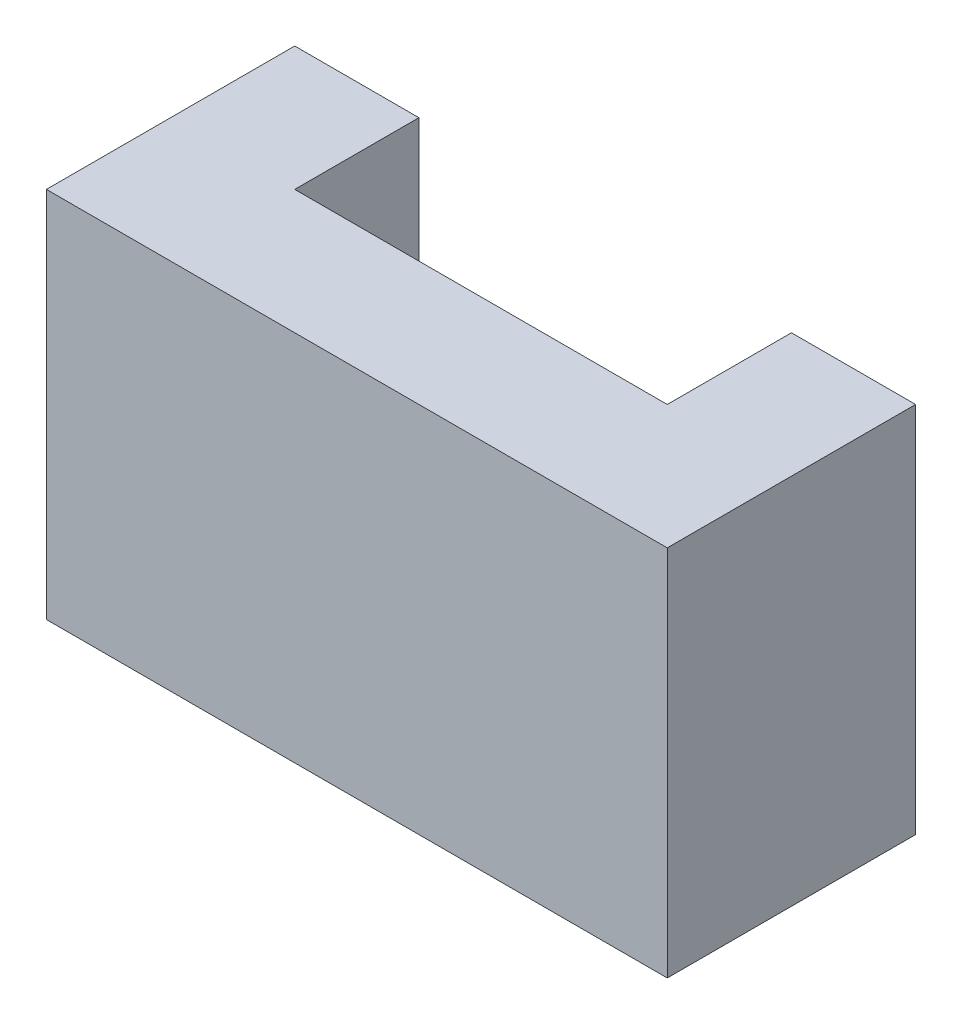
ISO-10303-21;
HEADER;
FILE_DESCRIPTION(('STEP AP214'),'2;1');
FILE_NAME('part.step','',(''),(''),'','','');
FILE_SCHEMA(('AUTOMOTIVE_DESIGN { 1 0 10303 214 1 1 1 1 }'));
ENDSEC;
DATA;
#1=APPLICATION_CONTEXT('core data for automotive mechanical design processes');
#2=APPLICATION_PROTOCOL_DEFINITION('international standard','automotive_design',2000,#1);
#3=PRODUCT_CONTEXT('',#1,'mechanical');
#4=PRODUCT('Part','Part','',(#3));
#5=PRODUCT_RELATED_PRODUCT_CATEGORY('part','',(#4));
#6=PRODUCT_DEFINITION_FORMATION('','',#4);
#7=PRODUCT_DEFINITION_CONTEXT('part definition',#1,'design');
#8=PRODUCT_DEFINITION('design','',#6,#7);
#9=PRODUCT_DEFINITION_SHAPE('','',#8);
#10=(LENGTH_UNIT() NAMED_UNIT(*) SI_UNIT(.MILLI.,.METRE.));
#11=(NAMED_UNIT(*) PLANE_ANGLE_UNIT() SI_UNIT($,.RADIAN.));
#12=(NAMED_UNIT(*) SI_UNIT($,.STERADIAN.) SOLID_ANGLE_UNIT());
#13=UNCERTAINTY_MEASURE_WITH_UNIT(LENGTH_MEASURE(1.E-05),#10,'distance_accuracy_value','');
#14=(GEOMETRIC_REPRESENTATION_CONTEXT(3) GLOBAL_UNCERTAINTY_ASSIGNED_CONTEXT((#13)) GLOBAL_UNIT_ASSIGNED_CONTEXT((#10,
#11,#12)) REPRESENTATION_CONTEXT('',''));
#15=CARTESIAN_POINT('',(0.,0.,0.));
#16=DIRECTION('',(0.,0.,1.));
#17=DIRECTION('',(1.,0.,0.));
#18=AXIS2_PLACEMENT_3D('',#15,#16,#17);
#19=CARTESIAN_POINT('',(-25.,30.,0.));
#20=DIRECTION('',(1.,0.,0.));
#21=DIRECTION('',(0.,0.,-1.));
#22=AXIS2_PLACEMENT_3D('',#19,#20,#21);
#23=PLANE('',#22);
#24=DIRECTION('',(0.,0.,1.));
#25=VECTOR('',#24,1.);
#26=CARTESIAN_POINT('',(-25.,0.,0.));
#27=LINE('',#26,#25);
#28=CARTESIAN_POINT('',(-25.,0.,0.));
#29=VERTEX_POINT('',#28);
#30=CARTESIAN_POINT('',(-25.,0.,20.));
#31=VERTEX_POINT('',#30);
#32=EDGE_CURVE('E140',#29,#31,#27,.T.);
#33=ORIENTED_EDGE('',*,*,#32,.T.);
#34=DIRECTION('',(0.,-1.,0.));
#35=VECTOR('',#34,1.);
#36=CARTESIAN_POINT('',(-25.,30.,20.));
#37=LINE('',#36,#35);
#38=CARTESIAN_POINT('',(-25.,30.,20.));
#39=VERTEX_POINT('',#38);
#40=EDGE_CURVE('E11',#39,#31,#37,.T.);
#41=ORIENTED_EDGE('',*,*,#40,.F.);
#42=DIRECTION('',(0.,0.,1.));
#43=VECTOR('',#42,1.);
#44=CARTESIAN_POINT('',(-25.,30.,0.));
#45=LINE('',#44,#43);
#46=CARTESIAN_POINT('',(-25.,30.,0.));
#47=VERTEX_POINT('',#46);
#48=EDGE_CURVE('E162',#47,#39,#45,.T.);
#49=ORIENTED_EDGE('',*,*,#48,.F.);
#50=DIRECTION('',(0.,-1.,0.));
#51=VECTOR('',#50,1.);
#52=CARTESIAN_POINT('',(-25.,30.,0.));
#53=LINE('',#52,#51);
#54=EDGE_CURVE('E136',#47,#29,#53,.T.);
#55=ORIENTED_EDGE('',*,*,#54,.T.);
#56=EDGE_LOOP('',(#33,#41,#49,#55));
#57=FACE_BOUND('',#56,.T.);
#58=ADVANCED_FACE('F39',(#57),#23,.F.);
#59=CARTESIAN_POINT('',(-25.,30.,20.));
#60=DIRECTION('',(0.,0.,-1.));
#61=DIRECTION('',(-1.,0.,0.));
#62=AXIS2_PLACEMENT_3D('',#59,#60,#61);
#63=PLANE('',#62);
#64=DIRECTION('',(1.,0.,0.));
#65=VECTOR('',#64,1.);
#66=CARTESIAN_POINT('',(-25.,0.,20.));
#67=LINE('',#66,#65);
#68=CARTESIAN_POINT('',(25.,0.,20.));
#69=VERTEX_POINT('',#68);
#70=EDGE_CURVE('E144',#31,#69,#67,.T.);
#71=ORIENTED_EDGE('',*,*,#70,.T.);
#72=DIRECTION('',(0.,-1.,0.));
#73=VECTOR('',#72,1.);
#74=CARTESIAN_POINT('',(25.,30.,20.));
#75=LINE('',#74,#73);
#76=CARTESIAN_POINT('',(25.,30.,20.));
#77=VERTEX_POINT('',#76);
#78=EDGE_CURVE('E48',#77,#69,#75,.T.);
#79=ORIENTED_EDGE('',*,*,#78,.F.);
#80=DIRECTION('',(1.,0.,0.));
#81=VECTOR('',#80,1.);
#82=CARTESIAN_POINT('',(-25.,30.,20.));
#83=LINE('',#82,#81);
#84=EDGE_CURVE('E99',#39,#77,#83,.T.);
#85=ORIENTED_EDGE('',*,*,#84,.F.);
#86=ORIENTED_EDGE('',*,*,#40,.T.);
#87=EDGE_LOOP('',(#71,#79,#85,#86));
#88=FACE_BOUND('',#87,.T.);
#89=ADVANCED_FACE('F208',(#88),#63,.F.);
#90=CARTESIAN_POINT('',(25.,30.,0.));
#91=DIRECTION('',(-1.,0.,0.));
#92=DIRECTION('',(0.,0.,1.));
#93=AXIS2_PLACEMENT_3D('',#90,#91,#92);
#94=PLANE('',#93);
#95=DIRECTION('',(0.,0.,-1.));
#96=VECTOR('',#95,1.);
#97=CARTESIAN_POINT('',(25.,0.,0.));
#98=LINE('',#97,#96);
#99=CARTESIAN_POINT('',(25.,0.,0.));
#100=VERTEX_POINT('',#99);
#101=EDGE_CURVE('E147',#69,#100,#98,.T.);
#102=ORIENTED_EDGE('',*,*,#101,.T.);
#103=DIRECTION('',(0.,-1.,0.));
#104=VECTOR('',#103,1.);
#105=CARTESIAN_POINT('',(25.,30.,0.));
#106=LINE('',#105,#104);
#107=CARTESIAN_POINT('',(25.,30.,0.));
#108=VERTEX_POINT('',#107);
#109=EDGE_CURVE('E173',#108,#100,#106,.T.);
#110=ORIENTED_EDGE('',*,*,#109,.F.);
#111=DIRECTION('',(0.,0.,-1.));
#112=VECTOR('',#111,1.);
#113=CARTESIAN_POINT('',(25.,30.,0.));
#114=LINE('',#113,#112);
#115=EDGE_CURVE('E183',#77,#108,#114,.T.);
#116=ORIENTED_EDGE('',*,*,#115,.F.);
#117=ORIENTED_EDGE('',*,*,#78,.T.);
#118=EDGE_LOOP('',(#102,#110,#116,#117));
#119=FACE_BOUND('',#118,.T.);
#120=ADVANCED_FACE('F181',(#119),#94,.F.);
#121=CARTESIAN_POINT('',(25.,30.,0.));
#122=DIRECTION('',(0.,0.,1.));
#123=DIRECTION('',(1.,0.,0.));
#124=AXIS2_PLACEMENT_3D('',#121,#122,#123);
#125=PLANE('',#124);
#126=DIRECTION('',(-1.,0.,0.));
#127=VECTOR('',#126,1.);
#128=CARTESIAN_POINT('',(25.,0.,0.));
#129=LINE('',#128,#127);
#130=CARTESIAN_POINT('',(15.,0.,0.));
#131=VERTEX_POINT('',#130);
#132=EDGE_CURVE('E150',#100,#131,#129,.T.);
#133=ORIENTED_EDGE('',*,*,#132,.T.);
#134=DIRECTION('',(0.,-1.,0.));
#135=VECTOR('',#134,1.);
#136=CARTESIAN_POINT('',(15.,30.,0.));
#137=LINE('',#136,#135);
#138=CARTESIAN_POINT('',(15.,30.,0.));
#139=VERTEX_POINT('',#138);
#140=EDGE_CURVE('E169',#139,#131,#137,.T.);
#141=ORIENTED_EDGE('',*,*,#140,.F.);
#142=DIRECTION('',(-1.,0.,0.));
#143=VECTOR('',#142,1.);
#144=CARTESIAN_POINT('',(25.,30.,0.));
#145=LINE('',#144,#143);
#146=EDGE_CURVE('E196',#108,#139,#145,.T.);
#147=ORIENTED_EDGE('',*,*,#146,.F.);
#148=ORIENTED_EDGE('',*,*,#109,.T.);
#149=EDGE_LOOP('',(#133,#141,#147,#148));
#150=FACE_BOUND('',#149,.T.);
#151=ADVANCED_FACE('F191',(#150),#125,.F.);
#152=CARTESIAN_POINT('',(15.,30.,0.));
#153=DIRECTION('',(1.,0.,0.));
#154=DIRECTION('',(0.,0.,-1.));
#155=AXIS2_PLACEMENT_3D('',#152,#153,#154);
#156=PLANE('',#155);
#157=DIRECTION('',(0.,0.,1.));
#158=VECTOR('',#157,1.);
#159=CARTESIAN_POINT('',(15.,0.,0.));
#160=LINE('',#159,#158);
#161=CARTESIAN_POINT('',(15.,0.,10.));
#162=VERTEX_POINT('',#161);
#163=EDGE_CURVE('E153',#131,#162,#160,.T.);
#164=ORIENTED_EDGE('',*,*,#163,.T.);
#165=DIRECTION('',(0.,-1.,0.));
#166=VECTOR('',#165,1.);
#167=CARTESIAN_POINT('',(15.,30.,10.));
#168=LINE('',#167,#166);
#169=CARTESIAN_POINT('',(15.,30.,10.));
#170=VERTEX_POINT('',#169);
#171=EDGE_CURVE('E129',#170,#162,#168,.T.);
#172=ORIENTED_EDGE('',*,*,#171,.F.);
#173=DIRECTION('',(0.,0.,1.));
#174=VECTOR('',#173,1.);
#175=CARTESIAN_POINT('',(15.,30.,0.));
#176=LINE('',#175,#174);
#177=EDGE_CURVE('E118',#139,#170,#176,.T.);
#178=ORIENTED_EDGE('',*,*,#177,.F.);
#179=ORIENTED_EDGE('',*,*,#140,.T.);
#180=EDGE_LOOP('',(#164,#172,#178,#179));
#181=FACE_BOUND('',#180,.T.);
#182=ADVANCED_FACE('F194',(#181),#156,.F.);
#183=CARTESIAN_POINT('',(-15.,30.,10.));
#184=DIRECTION('',(0.,0.,1.));
#185=DIRECTION('',(1.,0.,0.));
#186=AXIS2_PLACEMENT_3D('',#183,#184,#185);
#187=PLANE('',#186);
#188=DIRECTION('',(-1.,0.,0.));
#189=VECTOR('',#188,1.);
#190=CARTESIAN_POINT('',(-15.,0.,10.));
#191=LINE('',#190,#189);
#192=CARTESIAN_POINT('',(-15.,0.,10.));
#193=VERTEX_POINT('',#192);
#194=EDGE_CURVE('E127',#162,#193,#191,.T.);
#195=ORIENTED_EDGE('',*,*,#194,.T.);
#196=DIRECTION('',(0.,-1.,0.));
#197=VECTOR('',#196,1.);
#198=CARTESIAN_POINT('',(-15.,30.,10.));
#199=LINE('',#198,#197);
#200=CARTESIAN_POINT('',(-15.,30.,10.));
#201=VERTEX_POINT('',#200);
#202=EDGE_CURVE('E124',#201,#193,#199,.T.);
#203=ORIENTED_EDGE('',*,*,#202,.F.);
#204=DIRECTION('',(-1.,0.,0.));
#205=VECTOR('',#204,1.);
#206=CARTESIAN_POINT('',(-15.,30.,10.));
#207=LINE('',#206,#205);
#208=EDGE_CURVE('E112',#170,#201,#207,.T.);
#209=ORIENTED_EDGE('',*,*,#208,.F.);
#210=ORIENTED_EDGE('',*,*,#171,.T.);
#211=EDGE_LOOP('',(#195,#203,#209,#210));
#212=FACE_BOUND('',#211,.T.);
#213=ADVANCED_FACE('F125',(#212),#187,.F.);
#214=CARTESIAN_POINT('',(-15.,30.,0.));
#215=DIRECTION('',(-1.,0.,0.));
#216=DIRECTION('',(0.,0.,1.));
#217=AXIS2_PLACEMENT_3D('',#214,#215,#216);
#218=PLANE('',#217);
#219=DIRECTION('',(0.,0.,-1.));
#220=VECTOR('',#219,1.);
#221=CARTESIAN_POINT('',(-15.,0.,0.));
#222=LINE('',#221,#220);
#223=CARTESIAN_POINT('',(-15.,0.,0.));
#224=VERTEX_POINT('',#223);
#225=EDGE_CURVE('E85',#193,#224,#222,.T.);
#226=ORIENTED_EDGE('',*,*,#225,.T.);
#227=DIRECTION('',(0.,-1.,0.));
#228=VECTOR('',#227,1.);
#229=CARTESIAN_POINT('',(-15.,30.,0.));
#230=LINE('',#229,#228);
#231=CARTESIAN_POINT('',(-15.,30.,0.));
#232=VERTEX_POINT('',#231);
#233=EDGE_CURVE('E130',#232,#224,#230,.T.);
#234=ORIENTED_EDGE('',*,*,#233,.F.);
#235=DIRECTION('',(0.,0.,-1.));
#236=VECTOR('',#235,1.);
#237=CARTESIAN_POINT('',(-15.,30.,0.));
#238=LINE('',#237,#236);
#239=EDGE_CURVE('E116',#201,#232,#238,.T.);
#240=ORIENTED_EDGE('',*,*,#239,.F.);
#241=ORIENTED_EDGE('',*,*,#202,.T.);
#242=EDGE_LOOP('',(#226,#234,#240,#241));
#243=FACE_BOUND('',#242,.T.);
#244=ADVANCED_FACE('F132',(#243),#218,.F.);
#245=CARTESIAN_POINT('',(-25.,30.,0.));
#246=DIRECTION('',(0.,0.,1.));
#247=DIRECTION('',(1.,0.,0.));
#248=AXIS2_PLACEMENT_3D('',#245,#246,#247);
#249=PLANE('',#248);
#250=DIRECTION('',(-1.,0.,0.));
#251=VECTOR('',#250,1.);
#252=CARTESIAN_POINT('',(-25.,0.,0.));
#253=LINE('',#252,#251);
#254=EDGE_CURVE('E91',#224,#29,#253,.T.);
#255=ORIENTED_EDGE('',*,*,#254,.T.);
#256=ORIENTED_EDGE('',*,*,#54,.F.);
#257=DIRECTION('',(-1.,0.,0.));
#258=VECTOR('',#257,1.);
#259=CARTESIAN_POINT('',(-25.,30.,0.));
#260=LINE('',#259,#258);
#261=EDGE_CURVE('E56',#232,#47,#260,.T.);
#262=ORIENTED_EDGE('',*,*,#261,.F.);
#263=ORIENTED_EDGE('',*,*,#233,.T.);
#264=EDGE_LOOP('',(#255,#256,#262,#263));
#265=FACE_BOUND('',#264,.T.);
#266=ADVANCED_FACE('F224',(#265),#249,.F.);
#267=CARTESIAN_POINT('',(0.,30.,0.));
#268=DIRECTION('',(0.,1.,0.));
#269=DIRECTION('',(0.,0.,1.));
#270=AXIS2_PLACEMENT_3D('',#267,#268,#269);
#271=PLANE('',#270);
#272=ORIENTED_EDGE('',*,*,#48,.T.);
#273=ORIENTED_EDGE('',*,*,#84,.T.);
#274=ORIENTED_EDGE('',*,*,#115,.T.);
#275=ORIENTED_EDGE('',*,*,#146,.T.);
#276=ORIENTED_EDGE('',*,*,#177,.T.);
#277=ORIENTED_EDGE('',*,*,#208,.T.);
#278=ORIENTED_EDGE('',*,*,#239,.T.);
#279=ORIENTED_EDGE('',*,*,#261,.T.);
#280=EDGE_LOOP('',(#272,#273,#274,#275,#276,#277,#278,#279));
#281=FACE_BOUND('',#280,.T.);
#282=ADVANCED_FACE('F114',(#281),#271,.T.);
#283=CARTESIAN_POINT('',(0.,0.,0.));
#284=DIRECTION('',(0.,1.,0.));
#285=DIRECTION('',(0.,0.,1.));
#286=AXIS2_PLACEMENT_3D('',#283,#284,#285);
#287=PLANE('',#286);
#288=ORIENTED_EDGE('',*,*,#32,.F.);
#289=ORIENTED_EDGE('',*,*,#254,.F.);
#290=ORIENTED_EDGE('',*,*,#225,.F.);
#291=ORIENTED_EDGE('',*,*,#194,.F.);
#292=ORIENTED_EDGE('',*,*,#163,.F.);
#293=ORIENTED_EDGE('',*,*,#132,.F.);
#294=ORIENTED_EDGE('',*,*,#101,.F.);
#295=ORIENTED_EDGE('',*,*,#70,.F.);
#296=EDGE_LOOP('',(#288,#289,#290,#291,#292,#293,#294,#295));
#297=FACE_BOUND('',#296,.T.);
#298=ADVANCED_FACE('F187',(#297),#287,.F.);
#299=CLOSED_SHELL('',(#58,#89,#120,#151,#182,#213,#244,#266,#282,#298));
#300=MANIFOLD_SOLID_BREP('B2',#299);
#301=ADVANCED_BREP_SHAPE_REPRESENTATION('',(#18,#300),#14);
#302=SHAPE_DEFINITION_REPRESENTATION(#9,#301);
ENDSEC;
END-ISO-10303-21;
